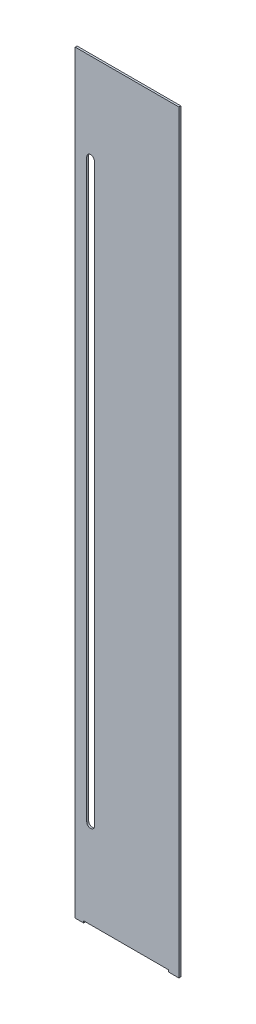
ISO-10303-21;
HEADER;
FILE_DESCRIPTION(('STEP AP214'),'2;1');
FILE_NAME('part.step','',(''),(''),'','','');
FILE_SCHEMA(('AUTOMOTIVE_DESIGN { 1 0 10303 214 1 1 1 1 }'));
ENDSEC;
DATA;
#1=APPLICATION_CONTEXT('core data for automotive mechanical design processes');
#2=APPLICATION_PROTOCOL_DEFINITION('international standard','automotive_design',2000,#1);
#3=PRODUCT_CONTEXT('',#1,'mechanical');
#4=PRODUCT('Part','Part','',(#3));
#5=PRODUCT_RELATED_PRODUCT_CATEGORY('part','',(#4));
#6=PRODUCT_DEFINITION_FORMATION('','',#4);
#7=PRODUCT_DEFINITION_CONTEXT('part definition',#1,'design');
#8=PRODUCT_DEFINITION('design','',#6,#7);
#9=PRODUCT_DEFINITION_SHAPE('','',#8);
#10=(LENGTH_UNIT() NAMED_UNIT(*) SI_UNIT(.MILLI.,.METRE.));
#11=(NAMED_UNIT(*) PLANE_ANGLE_UNIT() SI_UNIT($,.RADIAN.));
#12=(NAMED_UNIT(*) SI_UNIT($,.STERADIAN.) SOLID_ANGLE_UNIT());
#13=UNCERTAINTY_MEASURE_WITH_UNIT(LENGTH_MEASURE(1.E-05),#10,'distance_accuracy_value','');
#14=(GEOMETRIC_REPRESENTATION_CONTEXT(3) GLOBAL_UNCERTAINTY_ASSIGNED_CONTEXT((#13)) GLOBAL_UNIT_ASSIGNED_CONTEXT((#10,
#11,#12)) REPRESENTATION_CONTEXT('',''));
#15=CARTESIAN_POINT('',(0.,0.,0.));
#16=DIRECTION('',(0.,0.,1.));
#17=DIRECTION('',(1.,0.,0.));
#18=AXIS2_PLACEMENT_3D('',#15,#16,#17);
#19=CARTESIAN_POINT('',(-135.,-982.500000000002,5.));
#20=DIRECTION('',(0.,1.,0.));
#21=DIRECTION('',(0.,0.,1.));
#22=AXIS2_PLACEMENT_3D('',#19,#20,#21);
#23=PLANE('',#22);
#24=DIRECTION('',(1.,0.,0.));
#25=VECTOR('',#24,1.);
#26=CARTESIAN_POINT('',(-135.,-982.500000000002,0.));
#27=LINE('',#26,#25);
#28=CARTESIAN_POINT('',(-135.,-982.500000000002,0.));
#29=VERTEX_POINT('',#28);
#30=CARTESIAN_POINT('',(-113.,-982.500000000002,0.));
#31=VERTEX_POINT('',#30);
#32=EDGE_CURVE('E143',#29,#31,#27,.T.);
#33=ORIENTED_EDGE('',*,*,#32,.T.);
#34=DIRECTION('',(0.,0.,1.));
#35=VECTOR('',#34,1.);
#36=CARTESIAN_POINT('',(-113.,-982.500000000002,0.));
#37=LINE('',#36,#35);
#38=CARTESIAN_POINT('',(-113.,-982.500000000002,5.));
#39=VERTEX_POINT('',#38);
#40=EDGE_CURVE('E87',#31,#39,#37,.T.);
#41=ORIENTED_EDGE('',*,*,#40,.T.);
#42=DIRECTION('',(1.,0.,0.));
#43=VECTOR('',#42,1.);
#44=CARTESIAN_POINT('',(-135.,-982.500000000002,5.));
#45=LINE('',#44,#43);
#46=CARTESIAN_POINT('',(-135.,-982.500000000002,5.));
#47=VERTEX_POINT('',#46);
#48=EDGE_CURVE('E153',#47,#39,#45,.T.);
#49=ORIENTED_EDGE('',*,*,#48,.F.);
#50=DIRECTION('',(0.,0.,-1.));
#51=VECTOR('',#50,1.);
#52=CARTESIAN_POINT('',(-135.,-982.500000000002,5.));
#53=LINE('',#52,#51);
#54=EDGE_CURVE('E152',#47,#29,#53,.T.);
#55=ORIENTED_EDGE('',*,*,#54,.T.);
#56=EDGE_LOOP('',(#33,#41,#49,#55));
#57=FACE_BOUND('',#56,.T.);
#58=ADVANCED_FACE('F33',(#57),#23,.F.);
#59=CARTESIAN_POINT('',(135.,982.499999999998,5.));
#60=DIRECTION('',(-1.,0.,0.));
#61=DIRECTION('',(0.,-1.,0.));
#62=AXIS2_PLACEMENT_3D('',#59,#60,#61);
#63=PLANE('',#62);
#64=DIRECTION('',(0.,1.,0.));
#65=VECTOR('',#64,1.);
#66=CARTESIAN_POINT('',(135.,982.499999999998,0.));
#67=LINE('',#66,#65);
#68=CARTESIAN_POINT('',(135.,-982.500000000002,0.));
#69=VERTEX_POINT('',#68);
#70=CARTESIAN_POINT('',(135.,982.499999999998,0.));
#71=VERTEX_POINT('',#70);
#72=EDGE_CURVE('E149',#69,#71,#67,.T.);
#73=ORIENTED_EDGE('',*,*,#72,.T.);
#74=DIRECTION('',(0.,0.,-1.));
#75=VECTOR('',#74,1.);
#76=CARTESIAN_POINT('',(135.,982.499999999998,5.));
#77=LINE('',#76,#75);
#78=CARTESIAN_POINT('',(135.,982.499999999998,5.));
#79=VERTEX_POINT('',#78);
#80=EDGE_CURVE('E11',#79,#71,#77,.T.);
#81=ORIENTED_EDGE('',*,*,#80,.F.);
#82=DIRECTION('',(0.,1.,0.));
#83=VECTOR('',#82,1.);
#84=CARTESIAN_POINT('',(135.,982.499999999998,5.));
#85=LINE('',#84,#83);
#86=CARTESIAN_POINT('',(135.,-982.500000000002,5.));
#87=VERTEX_POINT('',#86);
#88=EDGE_CURVE('E151',#87,#79,#85,.T.);
#89=ORIENTED_EDGE('',*,*,#88,.F.);
#90=DIRECTION('',(0.,0.,-1.));
#91=VECTOR('',#90,1.);
#92=CARTESIAN_POINT('',(135.,-982.500000000002,5.));
#93=LINE('',#92,#91);
#94=EDGE_CURVE('E137',#87,#69,#93,.T.);
#95=ORIENTED_EDGE('',*,*,#94,.T.);
#96=EDGE_LOOP('',(#73,#81,#89,#95));
#97=FACE_BOUND('',#96,.T.);
#98=ADVANCED_FACE('F35',(#97),#63,.F.);
#99=CARTESIAN_POINT('',(-135.,982.499999999998,5.));
#100=DIRECTION('',(0.,-1.,0.));
#101=DIRECTION('',(1.,0.,0.));
#102=AXIS2_PLACEMENT_3D('',#99,#100,#101);
#103=PLANE('',#102);
#104=DIRECTION('',(-1.,0.,0.));
#105=VECTOR('',#104,1.);
#106=CARTESIAN_POINT('',(-135.,982.499999999998,0.));
#107=LINE('',#106,#105);
#108=CARTESIAN_POINT('',(-135.,982.499999999998,0.));
#109=VERTEX_POINT('',#108);
#110=EDGE_CURVE('E158',#71,#109,#107,.T.);
#111=ORIENTED_EDGE('',*,*,#110,.T.);
#112=DIRECTION('',(0.,0.,-1.));
#113=VECTOR('',#112,1.);
#114=CARTESIAN_POINT('',(-135.,982.499999999998,5.));
#115=LINE('',#114,#113);
#116=CARTESIAN_POINT('',(-135.,982.499999999998,5.));
#117=VERTEX_POINT('',#116);
#118=EDGE_CURVE('E42',#117,#109,#115,.T.);
#119=ORIENTED_EDGE('',*,*,#118,.F.);
#120=DIRECTION('',(-1.,0.,0.));
#121=VECTOR('',#120,1.);
#122=CARTESIAN_POINT('',(-135.,982.499999999998,5.));
#123=LINE('',#122,#121);
#124=EDGE_CURVE('E203',#79,#117,#123,.T.);
#125=ORIENTED_EDGE('',*,*,#124,.F.);
#126=ORIENTED_EDGE('',*,*,#80,.T.);
#127=EDGE_LOOP('',(#111,#119,#125,#126));
#128=FACE_BOUND('',#127,.T.);
#129=ADVANCED_FACE('F220',(#128),#103,.F.);
#130=CARTESIAN_POINT('',(-135.,982.499999999998,5.));
#131=DIRECTION('',(1.,0.,0.));
#132=DIRECTION('',(0.,1.,0.));
#133=AXIS2_PLACEMENT_3D('',#130,#131,#132);
#134=PLANE('',#133);
#135=DIRECTION('',(0.,-1.,0.));
#136=VECTOR('',#135,1.);
#137=CARTESIAN_POINT('',(-135.,982.499999999998,0.));
#138=LINE('',#137,#136);
#139=EDGE_CURVE('E144',#109,#29,#138,.T.);
#140=ORIENTED_EDGE('',*,*,#139,.T.);
#141=ORIENTED_EDGE('',*,*,#54,.F.);
#142=DIRECTION('',(0.,-1.,0.));
#143=VECTOR('',#142,1.);
#144=CARTESIAN_POINT('',(-135.,982.499999999998,5.));
#145=LINE('',#144,#143);
#146=EDGE_CURVE('E204',#117,#47,#145,.T.);
#147=ORIENTED_EDGE('',*,*,#146,.F.);
#148=ORIENTED_EDGE('',*,*,#118,.T.);
#149=EDGE_LOOP('',(#140,#141,#147,#148));
#150=FACE_BOUND('',#149,.T.);
#151=ADVANCED_FACE('F217',(#150),#134,.F.);
#152=CARTESIAN_POINT('',(108.,-982.500000000002,5.));
#153=VERTEX_POINT('',#152);
#154=EDGE_CURVE('E205',#153,#87,#45,.T.);
#155=ORIENTED_EDGE('',*,*,#154,.F.);
#156=DIRECTION('',(0.,0.,1.));
#157=VECTOR('',#156,1.);
#158=CARTESIAN_POINT('',(108.,-982.500000000002,0.));
#159=LINE('',#158,#157);
#160=CARTESIAN_POINT('',(108.,-982.500000000002,0.));
#161=VERTEX_POINT('',#160);
#162=EDGE_CURVE('E139',#161,#153,#159,.T.);
#163=ORIENTED_EDGE('',*,*,#162,.F.);
#164=EDGE_CURVE('E133',#161,#69,#27,.T.);
#165=ORIENTED_EDGE('',*,*,#164,.T.);
#166=ORIENTED_EDGE('',*,*,#94,.F.);
#167=EDGE_LOOP('',(#155,#163,#165,#166));
#168=FACE_BOUND('',#167,.T.);
#169=ADVANCED_FACE('F136',(#168),#23,.F.);
#170=CARTESIAN_POINT('',(0.,0.,5.));
#171=DIRECTION('',(0.,0.,1.));
#172=DIRECTION('',(1.,0.,0.));
#173=AXIS2_PLACEMENT_3D('',#170,#171,#172);
#174=PLANE('',#173);
#175=CARTESIAN_POINT('',(-94.9999999999998,750.,5.));
#176=DIRECTION('',(0.,0.,1.));
#177=DIRECTION('',(1.,0.,0.));
#178=AXIS2_PLACEMENT_3D('',#175,#176,#177);
#179=CIRCLE('',#178,10.0000000000002);
#180=CARTESIAN_POINT('',(-84.9999999999997,750.,5.));
#181=VERTEX_POINT('',#180);
#182=CARTESIAN_POINT('',(-105.,750.,5.));
#183=VERTEX_POINT('',#182);
#184=EDGE_CURVE('E37',#181,#183,#179,.T.);
#185=ORIENTED_EDGE('',*,*,#184,.F.);
#186=DIRECTION('',(0.,1.,0.));
#187=VECTOR('',#186,1.);
#188=CARTESIAN_POINT('',(-84.9999999999997,750.,5.));
#189=LINE('',#188,#187);
#190=CARTESIAN_POINT('',(-84.9999999999997,-750.,5.));
#191=VERTEX_POINT('',#190);
#192=EDGE_CURVE('E78',#191,#181,#189,.T.);
#193=ORIENTED_EDGE('',*,*,#192,.F.);
#194=CARTESIAN_POINT('',(-94.9999999999998,-750.,5.));
#195=DIRECTION('',(0.,0.,1.));
#196=DIRECTION('',(1.,0.,0.));
#197=AXIS2_PLACEMENT_3D('',#194,#195,#196);
#198=CIRCLE('',#197,10.0000000000002);
#199=CARTESIAN_POINT('',(-105.,-750.,5.));
#200=VERTEX_POINT('',#199);
#201=EDGE_CURVE('E175',#200,#191,#198,.T.);
#202=ORIENTED_EDGE('',*,*,#201,.F.);
#203=DIRECTION('',(0.,1.,0.));
#204=VECTOR('',#203,1.);
#205=CARTESIAN_POINT('',(-105.,750.,5.));
#206=LINE('',#205,#204);
#207=EDGE_CURVE('E173',#183,#200,#206,.F.);
#208=ORIENTED_EDGE('',*,*,#207,.F.);
#209=EDGE_LOOP('',(#185,#193,#202,#208));
#210=FACE_BOUND('',#209,.T.);
#211=DIRECTION('',(0.,-1.,0.));
#212=VECTOR('',#211,1.);
#213=CARTESIAN_POINT('',(-113.,0.,5.));
#214=LINE('',#213,#212);
#215=CARTESIAN_POINT('',(-113.,-977.500000000002,5.));
#216=VERTEX_POINT('',#215);
#217=EDGE_CURVE('E159',#216,#39,#214,.T.);
#218=ORIENTED_EDGE('',*,*,#217,.F.);
#219=DIRECTION('',(-1.,0.,0.));
#220=VECTOR('',#219,1.);
#221=CARTESIAN_POINT('',(0.,-977.500000000002,5.));
#222=LINE('',#221,#220);
#223=CARTESIAN_POINT('',(108.,-977.500000000002,5.));
#224=VERTEX_POINT('',#223);
#225=EDGE_CURVE('E162',#224,#216,#222,.T.);
#226=ORIENTED_EDGE('',*,*,#225,.F.);
#227=DIRECTION('',(0.,1.,0.));
#228=VECTOR('',#227,1.);
#229=CARTESIAN_POINT('',(108.,0.,5.));
#230=LINE('',#229,#228);
#231=EDGE_CURVE('E194',#153,#224,#230,.T.);
#232=ORIENTED_EDGE('',*,*,#231,.F.);
#233=ORIENTED_EDGE('',*,*,#154,.T.);
#234=ORIENTED_EDGE('',*,*,#88,.T.);
#235=ORIENTED_EDGE('',*,*,#124,.T.);
#236=ORIENTED_EDGE('',*,*,#146,.T.);
#237=ORIENTED_EDGE('',*,*,#48,.T.);
#238=EDGE_LOOP('',(#218,#226,#232,#233,#234,#235,#236,#237));
#239=FACE_BOUND('',#238,.T.);
#240=ADVANCED_FACE('F213',(#210,#239),#174,.T.);
#241=CARTESIAN_POINT('',(0.,0.,0.));
#242=DIRECTION('',(0.,0.,1.));
#243=DIRECTION('',(1.,0.,0.));
#244=AXIS2_PLACEMENT_3D('',#241,#242,#243);
#245=PLANE('',#244);
#246=DIRECTION('',(0.,1.,0.));
#247=VECTOR('',#246,1.);
#248=CARTESIAN_POINT('',(-84.9999999999997,750.,0.));
#249=LINE('',#248,#247);
#250=CARTESIAN_POINT('',(-84.9999999999997,-750.,0.));
#251=VERTEX_POINT('',#250);
#252=CARTESIAN_POINT('',(-84.9999999999997,750.,0.));
#253=VERTEX_POINT('',#252);
#254=EDGE_CURVE('E346',#251,#253,#249,.T.);
#255=ORIENTED_EDGE('',*,*,#254,.T.);
#256=CARTESIAN_POINT('',(-94.9999999999998,750.,0.));
#257=DIRECTION('',(0.,0.,1.));
#258=DIRECTION('',(1.,0.,0.));
#259=AXIS2_PLACEMENT_3D('',#256,#257,#258);
#260=CIRCLE('',#259,10.0000000000002);
#261=CARTESIAN_POINT('',(-105.,750.,0.));
#262=VERTEX_POINT('',#261);
#263=EDGE_CURVE('E353',#253,#262,#260,.T.);
#264=ORIENTED_EDGE('',*,*,#263,.T.);
#265=DIRECTION('',(0.,-1.,0.));
#266=VECTOR('',#265,1.);
#267=CARTESIAN_POINT('',(-105.,750.,0.));
#268=LINE('',#267,#266);
#269=CARTESIAN_POINT('',(-105.,-750.,0.));
#270=VERTEX_POINT('',#269);
#271=EDGE_CURVE('E350',#262,#270,#268,.T.);
#272=ORIENTED_EDGE('',*,*,#271,.T.);
#273=CARTESIAN_POINT('',(-94.9999999999998,-750.,0.));
#274=DIRECTION('',(0.,0.,1.));
#275=DIRECTION('',(1.,0.,0.));
#276=AXIS2_PLACEMENT_3D('',#273,#274,#275);
#277=CIRCLE('',#276,10.0000000000002);
#278=EDGE_CURVE('E59',#270,#251,#277,.T.);
#279=ORIENTED_EDGE('',*,*,#278,.T.);
#280=EDGE_LOOP('',(#255,#264,#272,#279));
#281=FACE_BOUND('',#280,.T.);
#282=DIRECTION('',(-1.,0.,0.));
#283=VECTOR('',#282,1.);
#284=CARTESIAN_POINT('',(-113.,-977.500000000002,0.));
#285=LINE('',#284,#283);
#286=CARTESIAN_POINT('',(108.,-977.500000000002,0.));
#287=VERTEX_POINT('',#286);
#288=CARTESIAN_POINT('',(-113.,-977.500000000002,0.));
#289=VERTEX_POINT('',#288);
#290=EDGE_CURVE('E184',#287,#289,#285,.T.);
#291=ORIENTED_EDGE('',*,*,#290,.T.);
#292=DIRECTION('',(0.,-1.,0.));
#293=VECTOR('',#292,1.);
#294=CARTESIAN_POINT('',(-113.,-982.500000000002,0.));
#295=LINE('',#294,#293);
#296=EDGE_CURVE('E177',#289,#31,#295,.T.);
#297=ORIENTED_EDGE('',*,*,#296,.T.);
#298=ORIENTED_EDGE('',*,*,#32,.F.);
#299=ORIENTED_EDGE('',*,*,#139,.F.);
#300=ORIENTED_EDGE('',*,*,#110,.F.);
#301=ORIENTED_EDGE('',*,*,#72,.F.);
#302=ORIENTED_EDGE('',*,*,#164,.F.);
#303=DIRECTION('',(0.,1.,0.));
#304=VECTOR('',#303,1.);
#305=CARTESIAN_POINT('',(108.,-982.500000000002,0.));
#306=LINE('',#305,#304);
#307=EDGE_CURVE('E181',#161,#287,#306,.T.);
#308=ORIENTED_EDGE('',*,*,#307,.T.);
#309=EDGE_LOOP('',(#291,#297,#298,#299,#300,#301,#302,#308));
#310=FACE_BOUND('',#309,.T.);
#311=ADVANCED_FACE('F156',(#281,#310),#245,.F.);
#312=CARTESIAN_POINT('',(-113.,-982.500000000002,0.));
#313=DIRECTION('',(-1.,0.,0.));
#314=DIRECTION('',(0.,0.,1.));
#315=AXIS2_PLACEMENT_3D('',#312,#313,#314);
#316=PLANE('',#315);
#317=ORIENTED_EDGE('',*,*,#217,.T.);
#318=ORIENTED_EDGE('',*,*,#40,.F.);
#319=ORIENTED_EDGE('',*,*,#296,.F.);
#320=DIRECTION('',(0.,0.,1.));
#321=VECTOR('',#320,1.);
#322=CARTESIAN_POINT('',(-113.,-977.500000000002,0.));
#323=LINE('',#322,#321);
#324=EDGE_CURVE('E191',#289,#216,#323,.T.);
#325=ORIENTED_EDGE('',*,*,#324,.T.);
#326=EDGE_LOOP('',(#317,#318,#319,#325));
#327=FACE_BOUND('',#326,.T.);
#328=ADVANCED_FACE('F241',(#327),#316,.F.);
#329=CARTESIAN_POINT('',(-113.,-977.500000000002,0.));
#330=DIRECTION('',(0.,1.,0.));
#331=DIRECTION('',(0.,0.,1.));
#332=AXIS2_PLACEMENT_3D('',#329,#330,#331);
#333=PLANE('',#332);
#334=ORIENTED_EDGE('',*,*,#225,.T.);
#335=ORIENTED_EDGE('',*,*,#324,.F.);
#336=ORIENTED_EDGE('',*,*,#290,.F.);
#337=DIRECTION('',(0.,0.,1.));
#338=VECTOR('',#337,1.);
#339=CARTESIAN_POINT('',(108.,-977.500000000002,0.));
#340=LINE('',#339,#338);
#341=EDGE_CURVE('E195',#287,#224,#340,.T.);
#342=ORIENTED_EDGE('',*,*,#341,.T.);
#343=EDGE_LOOP('',(#334,#335,#336,#342));
#344=FACE_BOUND('',#343,.T.);
#345=ADVANCED_FACE('F246',(#344),#333,.F.);
#346=CARTESIAN_POINT('',(108.,-982.500000000002,0.));
#347=DIRECTION('',(1.,0.,0.));
#348=DIRECTION('',(0.,0.,-1.));
#349=AXIS2_PLACEMENT_3D('',#346,#347,#348);
#350=PLANE('',#349);
#351=ORIENTED_EDGE('',*,*,#231,.T.);
#352=ORIENTED_EDGE('',*,*,#341,.F.);
#353=ORIENTED_EDGE('',*,*,#307,.F.);
#354=ORIENTED_EDGE('',*,*,#162,.T.);
#355=EDGE_LOOP('',(#351,#352,#353,#354));
#356=FACE_BOUND('',#355,.T.);
#357=ADVANCED_FACE('F247',(#356),#350,.F.);
#358=CARTESIAN_POINT('',(-94.9999999999998,750.,0.));
#359=DIRECTION('',(0.,0.,1.));
#360=DIRECTION('',(1.,0.,0.));
#361=AXIS2_PLACEMENT_3D('',#358,#359,#360);
#362=CYLINDRICAL_SURFACE('',#361,10.0000000000002);
#363=ORIENTED_EDGE('',*,*,#184,.T.);
#364=DIRECTION('',(0.,0.,1.));
#365=VECTOR('',#364,1.);
#366=CARTESIAN_POINT('',(-105.,750.,0.));
#367=LINE('',#366,#365);
#368=EDGE_CURVE('E50',#262,#183,#367,.T.);
#369=ORIENTED_EDGE('',*,*,#368,.F.);
#370=ORIENTED_EDGE('',*,*,#263,.F.);
#371=DIRECTION('',(0.,0.,1.));
#372=VECTOR('',#371,1.);
#373=CARTESIAN_POINT('',(-84.9999999999997,750.,0.));
#374=LINE('',#373,#372);
#375=EDGE_CURVE('E176',#253,#181,#374,.T.);
#376=ORIENTED_EDGE('',*,*,#375,.T.);
#377=EDGE_LOOP('',(#363,#369,#370,#376));
#378=FACE_BOUND('',#377,.T.);
#379=ADVANCED_FACE('F250',(#378),#362,.F.);
#380=CARTESIAN_POINT('',(-84.9999999999997,750.,0.));
#381=DIRECTION('',(1.,0.,0.));
#382=DIRECTION('',(0.,0.,-1.));
#383=AXIS2_PLACEMENT_3D('',#380,#381,#382);
#384=PLANE('',#383);
#385=ORIENTED_EDGE('',*,*,#192,.T.);
#386=ORIENTED_EDGE('',*,*,#375,.F.);
#387=ORIENTED_EDGE('',*,*,#254,.F.);
#388=DIRECTION('',(0.,0.,1.));
#389=VECTOR('',#388,1.);
#390=CARTESIAN_POINT('',(-84.9999999999997,-750.,0.));
#391=LINE('',#390,#389);
#392=EDGE_CURVE('E343',#251,#191,#391,.T.);
#393=ORIENTED_EDGE('',*,*,#392,.T.);
#394=EDGE_LOOP('',(#385,#386,#387,#393));
#395=FACE_BOUND('',#394,.T.);
#396=ADVANCED_FACE('F257',(#395),#384,.F.);
#397=CARTESIAN_POINT('',(-94.9999999999998,-750.,0.));
#398=DIRECTION('',(0.,0.,1.));
#399=DIRECTION('',(1.,0.,0.));
#400=AXIS2_PLACEMENT_3D('',#397,#398,#399);
#401=CYLINDRICAL_SURFACE('',#400,10.0000000000002);
#402=ORIENTED_EDGE('',*,*,#201,.T.);
#403=ORIENTED_EDGE('',*,*,#392,.F.);
#404=ORIENTED_EDGE('',*,*,#278,.F.);
#405=DIRECTION('',(0.,0.,1.));
#406=VECTOR('',#405,1.);
#407=CARTESIAN_POINT('',(-105.,-750.,0.));
#408=LINE('',#407,#406);
#409=EDGE_CURVE('E187',#270,#200,#408,.T.);
#410=ORIENTED_EDGE('',*,*,#409,.T.);
#411=EDGE_LOOP('',(#402,#403,#404,#410));
#412=FACE_BOUND('',#411,.T.);
#413=ADVANCED_FACE('F261',(#412),#401,.F.);
#414=CARTESIAN_POINT('',(-105.,750.,0.));
#415=DIRECTION('',(-1.,0.,0.));
#416=DIRECTION('',(0.,0.,1.));
#417=AXIS2_PLACEMENT_3D('',#414,#415,#416);
#418=PLANE('',#417);
#419=ORIENTED_EDGE('',*,*,#207,.T.);
#420=ORIENTED_EDGE('',*,*,#409,.F.);
#421=ORIENTED_EDGE('',*,*,#271,.F.);
#422=ORIENTED_EDGE('',*,*,#368,.T.);
#423=EDGE_LOOP('',(#419,#420,#421,#422));
#424=FACE_BOUND('',#423,.T.);
#425=ADVANCED_FACE('F258',(#424),#418,.F.);
#426=CLOSED_SHELL('',(#58,#98,#129,#151,#169,#240,#311,#328,#345,#357,#379,#396,#413,#425));
#427=MANIFOLD_SOLID_BREP('B2',#426);
#428=ADVANCED_BREP_SHAPE_REPRESENTATION('',(#18,#427),#14);
#429=SHAPE_DEFINITION_REPRESENTATION(#9,#428);
ENDSEC;
END-ISO-10303-21;
